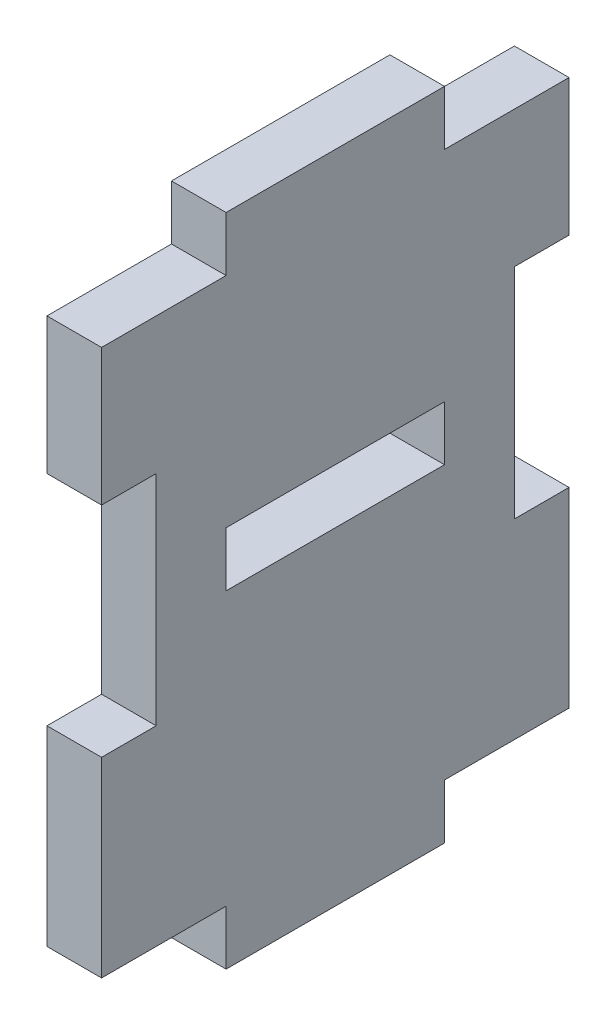
ISO-10303-21;
HEADER;
FILE_DESCRIPTION(('STEP AP214'),'2;1');
FILE_NAME('part.step','',(''),(''),'','','');
FILE_SCHEMA(('AUTOMOTIVE_DESIGN { 1 0 10303 214 1 1 1 1 }'));
ENDSEC;
DATA;
#1=APPLICATION_CONTEXT('core data for automotive mechanical design processes');
#2=APPLICATION_PROTOCOL_DEFINITION('international standard','automotive_design',2000,#1);
#3=PRODUCT_CONTEXT('',#1,'mechanical');
#4=PRODUCT('Part','Part','',(#3));
#5=PRODUCT_RELATED_PRODUCT_CATEGORY('part','',(#4));
#6=PRODUCT_DEFINITION_FORMATION('','',#4);
#7=PRODUCT_DEFINITION_CONTEXT('part definition',#1,'design');
#8=PRODUCT_DEFINITION('design','',#6,#7);
#9=PRODUCT_DEFINITION_SHAPE('','',#8);
#10=(LENGTH_UNIT() NAMED_UNIT(*) SI_UNIT(.MILLI.,.METRE.));
#11=(NAMED_UNIT(*) PLANE_ANGLE_UNIT() SI_UNIT($,.RADIAN.));
#12=(NAMED_UNIT(*) SI_UNIT($,.STERADIAN.) SOLID_ANGLE_UNIT());
#13=UNCERTAINTY_MEASURE_WITH_UNIT(LENGTH_MEASURE(1.E-05),#10,'distance_accuracy_value','');
#14=(GEOMETRIC_REPRESENTATION_CONTEXT(3) GLOBAL_UNCERTAINTY_ASSIGNED_CONTEXT((#13)) GLOBAL_UNIT_ASSIGNED_CONTEXT((#10,
#11,#12)) REPRESENTATION_CONTEXT('',''));
#15=CARTESIAN_POINT('',(0.,0.,0.));
#16=DIRECTION('',(0.,0.,1.));
#17=DIRECTION('',(1.,0.,0.));
#18=AXIS2_PLACEMENT_3D('',#15,#16,#17);
#19=CARTESIAN_POINT('',(6.35,0.,-39.878));
#20=DIRECTION('',(1.,0.,0.));
#21=DIRECTION('',(0.,0.,-1.));
#22=AXIS2_PLACEMENT_3D('',#19,#20,#21);
#23=PLANE('',#22);
#24=DIRECTION('',(0.,0.,-1.));
#25=VECTOR('',#24,1.);
#26=CARTESIAN_POINT('',(6.35,0.,-14.478));
#27=LINE('',#26,#25);
#28=CARTESIAN_POINT('',(6.35,0.,-14.478));
#29=VERTEX_POINT('',#28);
#30=CARTESIAN_POINT('',(6.35,0.,-39.878));
#31=VERTEX_POINT('',#30);
#32=EDGE_CURVE('E228',#29,#31,#27,.T.);
#33=ORIENTED_EDGE('',*,*,#32,.T.);
#34=DIRECTION('',(0.,1.,0.));
#35=VECTOR('',#34,1.);
#36=CARTESIAN_POINT('',(6.35,0.,-39.878));
#37=LINE('',#36,#35);
#38=CARTESIAN_POINT('',(6.35,6.35,-39.878));
#39=VERTEX_POINT('',#38);
#40=EDGE_CURVE('E231',#31,#39,#37,.T.);
#41=ORIENTED_EDGE('',*,*,#40,.T.);
#42=DIRECTION('',(0.,0.,-1.));
#43=VECTOR('',#42,1.);
#44=CARTESIAN_POINT('',(6.35,6.35,-39.878));
#45=LINE('',#44,#43);
#46=CARTESIAN_POINT('',(6.35,6.35,-54.356));
#47=VERTEX_POINT('',#46);
#48=EDGE_CURVE('E234',#39,#47,#45,.T.);
#49=ORIENTED_EDGE('',*,*,#48,.T.);
#50=DIRECTION('',(0.,1.,0.));
#51=VECTOR('',#50,1.);
#52=CARTESIAN_POINT('',(6.35,6.35,-54.356));
#53=LINE('',#52,#51);
#54=CARTESIAN_POINT('',(6.35,28.575,-54.356));
#55=VERTEX_POINT('',#54);
#56=EDGE_CURVE('E236',#47,#55,#53,.T.);
#57=ORIENTED_EDGE('',*,*,#56,.T.);
#58=DIRECTION('',(0.,0.,1.));
#59=VECTOR('',#58,1.);
#60=CARTESIAN_POINT('',(6.35,28.575,-48.006));
#61=LINE('',#60,#59);
#62=CARTESIAN_POINT('',(6.35,28.575,-48.006));
#63=VERTEX_POINT('',#62);
#64=EDGE_CURVE('E238',#55,#63,#61,.T.);
#65=ORIENTED_EDGE('',*,*,#64,.T.);
#66=DIRECTION('',(0.,1.,0.));
#67=VECTOR('',#66,1.);
#68=CARTESIAN_POINT('',(6.35,53.975,-48.006));
#69=LINE('',#68,#67);
#70=CARTESIAN_POINT('',(6.35,53.975,-48.006));
#71=VERTEX_POINT('',#70);
#72=EDGE_CURVE('E240',#63,#71,#69,.T.);
#73=ORIENTED_EDGE('',*,*,#72,.T.);
#74=DIRECTION('',(0.,0.,-1.));
#75=VECTOR('',#74,1.);
#76=CARTESIAN_POINT('',(6.35,53.975,-54.356));
#77=LINE('',#76,#75);
#78=CARTESIAN_POINT('',(6.35,53.975,-54.356));
#79=VERTEX_POINT('',#78);
#80=EDGE_CURVE('E242',#71,#79,#77,.T.);
#81=ORIENTED_EDGE('',*,*,#80,.T.);
#82=DIRECTION('',(0.,1.,0.));
#83=VECTOR('',#82,1.);
#84=CARTESIAN_POINT('',(6.35,53.975,-54.356));
#85=LINE('',#84,#83);
#86=CARTESIAN_POINT('',(6.35,69.85,-54.356));
#87=VERTEX_POINT('',#86);
#88=EDGE_CURVE('E244',#79,#87,#85,.T.);
#89=ORIENTED_EDGE('',*,*,#88,.T.);
#90=DIRECTION('',(0.,0.,1.));
#91=VECTOR('',#90,1.);
#92=CARTESIAN_POINT('',(6.35,69.85,-54.356));
#93=LINE('',#92,#91);
#94=CARTESIAN_POINT('',(6.35,69.85,-39.878));
#95=VERTEX_POINT('',#94);
#96=EDGE_CURVE('E246',#87,#95,#93,.T.);
#97=ORIENTED_EDGE('',*,*,#96,.T.);
#98=DIRECTION('',(0.,1.,0.));
#99=VECTOR('',#98,1.);
#100=CARTESIAN_POINT('',(6.35,76.2,-39.878));
#101=LINE('',#100,#99);
#102=CARTESIAN_POINT('',(6.35,76.2,-39.878));
#103=VERTEX_POINT('',#102);
#104=EDGE_CURVE('E248',#95,#103,#101,.T.);
#105=ORIENTED_EDGE('',*,*,#104,.T.);
#106=DIRECTION('',(0.,0.,1.));
#107=VECTOR('',#106,1.);
#108=CARTESIAN_POINT('',(6.35,76.2,-14.478));
#109=LINE('',#108,#107);
#110=CARTESIAN_POINT('',(6.35,76.2,-14.478));
#111=VERTEX_POINT('',#110);
#112=EDGE_CURVE('E250',#103,#111,#109,.T.);
#113=ORIENTED_EDGE('',*,*,#112,.T.);
#114=DIRECTION('',(0.,-1.,0.));
#115=VECTOR('',#114,1.);
#116=CARTESIAN_POINT('',(6.35,69.85,-14.478));
#117=LINE('',#116,#115);
#118=CARTESIAN_POINT('',(6.35,69.85,-14.478));
#119=VERTEX_POINT('',#118);
#120=EDGE_CURVE('E252',#111,#119,#117,.T.);
#121=ORIENTED_EDGE('',*,*,#120,.T.);
#122=DIRECTION('',(0.,0.,1.));
#123=VECTOR('',#122,1.);
#124=CARTESIAN_POINT('',(6.35,69.85,-14.478));
#125=LINE('',#124,#123);
#126=CARTESIAN_POINT('',(6.35,69.85,0.));
#127=VERTEX_POINT('',#126);
#128=EDGE_CURVE('E254',#119,#127,#125,.T.);
#129=ORIENTED_EDGE('',*,*,#128,.T.);
#130=DIRECTION('',(0.,-1.,0.));
#131=VECTOR('',#130,1.);
#132=CARTESIAN_POINT('',(6.35,69.85,0.));
#133=LINE('',#132,#131);
#134=CARTESIAN_POINT('',(6.35,53.975,0.));
#135=VERTEX_POINT('',#134);
#136=EDGE_CURVE('E256',#127,#135,#133,.T.);
#137=ORIENTED_EDGE('',*,*,#136,.T.);
#138=DIRECTION('',(0.,0.,-1.));
#139=VECTOR('',#138,1.);
#140=CARTESIAN_POINT('',(6.35,53.975,0.));
#141=LINE('',#140,#139);
#142=CARTESIAN_POINT('',(6.35,53.975,-6.34999999999999));
#143=VERTEX_POINT('',#142);
#144=EDGE_CURVE('E258',#135,#143,#141,.T.);
#145=ORIENTED_EDGE('',*,*,#144,.T.);
#146=DIRECTION('',(0.,-1.,0.));
#147=VECTOR('',#146,1.);
#148=CARTESIAN_POINT('',(6.35,53.975,-6.34999999999999));
#149=LINE('',#148,#147);
#150=CARTESIAN_POINT('',(6.35,28.575,-6.35));
#151=VERTEX_POINT('',#150);
#152=EDGE_CURVE('E260',#143,#151,#149,.T.);
#153=ORIENTED_EDGE('',*,*,#152,.T.);
#154=DIRECTION('',(0.,0.,1.));
#155=VECTOR('',#154,1.);
#156=CARTESIAN_POINT('',(6.35,28.575,-6.35));
#157=LINE('',#156,#155);
#158=CARTESIAN_POINT('',(6.35,28.575,0.));
#159=VERTEX_POINT('',#158);
#160=EDGE_CURVE('E262',#151,#159,#157,.T.);
#161=ORIENTED_EDGE('',*,*,#160,.T.);
#162=DIRECTION('',(0.,-1.,0.));
#163=VECTOR('',#162,1.);
#164=CARTESIAN_POINT('',(6.35,28.575,0.));
#165=LINE('',#164,#163);
#166=CARTESIAN_POINT('',(6.35,6.35,0.));
#167=VERTEX_POINT('',#166);
#168=EDGE_CURVE('E264',#159,#167,#165,.T.);
#169=ORIENTED_EDGE('',*,*,#168,.T.);
#170=DIRECTION('',(0.,0.,-1.));
#171=VECTOR('',#170,1.);
#172=CARTESIAN_POINT('',(6.35,6.35,0.));
#173=LINE('',#172,#171);
#174=CARTESIAN_POINT('',(6.35,6.34999999999999,-14.478));
#175=VERTEX_POINT('',#174);
#176=EDGE_CURVE('E266',#167,#175,#173,.T.);
#177=ORIENTED_EDGE('',*,*,#176,.T.);
#178=DIRECTION('',(0.,-1.,0.));
#179=VECTOR('',#178,1.);
#180=CARTESIAN_POINT('',(6.35,0.,-14.478));
#181=LINE('',#180,#179);
#182=EDGE_CURVE('E268',#175,#29,#181,.T.);
#183=ORIENTED_EDGE('',*,*,#182,.T.);
#184=EDGE_LOOP('',(#33,#41,#49,#57,#65,#73,#81,#89,#97,#105,#113,#121,#129,#137,#145,#153,#161,
#169,#177,#183));
#185=FACE_BOUND('',#184,.T.);
#186=DIRECTION('',(0.,0.,-1.));
#187=VECTOR('',#186,1.);
#188=CARTESIAN_POINT('',(6.35,38.1,-14.478));
#189=LINE('',#188,#187);
#190=CARTESIAN_POINT('',(6.35,38.1,-14.478));
#191=VERTEX_POINT('',#190);
#192=CARTESIAN_POINT('',(6.35,38.1,-39.8780000000001));
#193=VERTEX_POINT('',#192);
#194=EDGE_CURVE('E200',#191,#193,#189,.T.);
#195=ORIENTED_EDGE('',*,*,#194,.F.);
#196=DIRECTION('',(0.,-1.,0.));
#197=VECTOR('',#196,1.);
#198=CARTESIAN_POINT('',(6.35,44.45,-14.478));
#199=LINE('',#198,#197);
#200=CARTESIAN_POINT('',(6.35,44.45,-14.478));
#201=VERTEX_POINT('',#200);
#202=EDGE_CURVE('E192',#201,#191,#199,.T.);
#203=ORIENTED_EDGE('',*,*,#202,.F.);
#204=DIRECTION('',(0.,0.,1.));
#205=VECTOR('',#204,1.);
#206=CARTESIAN_POINT('',(6.35,44.45,-14.478));
#207=LINE('',#206,#205);
#208=CARTESIAN_POINT('',(6.35,44.45,-39.8780000000001));
#209=VERTEX_POINT('',#208);
#210=EDGE_CURVE('E214',#209,#201,#207,.T.);
#211=ORIENTED_EDGE('',*,*,#210,.F.);
#212=DIRECTION('',(0.,1.,0.));
#213=VECTOR('',#212,1.);
#214=CARTESIAN_POINT('',(6.35,44.45,-39.8780000000001));
#215=LINE('',#214,#213);
#216=EDGE_CURVE('E212',#193,#209,#215,.T.);
#217=ORIENTED_EDGE('',*,*,#216,.F.);
#218=EDGE_LOOP('',(#195,#203,#211,#217));
#219=FACE_BOUND('',#218,.T.);
#220=ADVANCED_FACE('F31',(#185,#219),#23,.T.);
#221=CARTESIAN_POINT('',(0.,0.,-39.878));
#222=DIRECTION('',(1.,0.,0.));
#223=DIRECTION('',(0.,0.,-1.));
#224=AXIS2_PLACEMENT_3D('',#221,#222,#223);
#225=PLANE('',#224);
#226=DIRECTION('',(0.,0.,-1.));
#227=VECTOR('',#226,1.);
#228=CARTESIAN_POINT('',(0.,0.,-14.478));
#229=LINE('',#228,#227);
#230=CARTESIAN_POINT('',(0.,0.,-14.478));
#231=VERTEX_POINT('',#230);
#232=CARTESIAN_POINT('',(0.,0.,-39.878));
#233=VERTEX_POINT('',#232);
#234=EDGE_CURVE('E208',#231,#233,#229,.T.);
#235=ORIENTED_EDGE('',*,*,#234,.F.);
#236=DIRECTION('',(0.,-1.,0.));
#237=VECTOR('',#236,1.);
#238=CARTESIAN_POINT('',(0.,0.,-14.478));
#239=LINE('',#238,#237);
#240=CARTESIAN_POINT('',(0.,6.34999999999999,-14.478));
#241=VERTEX_POINT('',#240);
#242=EDGE_CURVE('E232',#241,#231,#239,.T.);
#243=ORIENTED_EDGE('',*,*,#242,.F.);
#244=DIRECTION('',(0.,0.,-1.));
#245=VECTOR('',#244,1.);
#246=CARTESIAN_POINT('',(0.,6.35,0.));
#247=LINE('',#246,#245);
#248=CARTESIAN_POINT('',(0.,6.35,0.));
#249=VERTEX_POINT('',#248);
#250=EDGE_CURVE('E307',#249,#241,#247,.T.);
#251=ORIENTED_EDGE('',*,*,#250,.F.);
#252=DIRECTION('',(0.,-1.,0.));
#253=VECTOR('',#252,1.);
#254=CARTESIAN_POINT('',(0.,28.575,0.));
#255=LINE('',#254,#253);
#256=CARTESIAN_POINT('',(0.,28.575,0.));
#257=VERTEX_POINT('',#256);
#258=EDGE_CURVE('E305',#257,#249,#255,.T.);
#259=ORIENTED_EDGE('',*,*,#258,.F.);
#260=DIRECTION('',(0.,0.,1.));
#261=VECTOR('',#260,1.);
#262=CARTESIAN_POINT('',(0.,28.575,-6.35));
#263=LINE('',#262,#261);
#264=CARTESIAN_POINT('',(0.,28.575,-6.35));
#265=VERTEX_POINT('',#264);
#266=EDGE_CURVE('E303',#265,#257,#263,.T.);
#267=ORIENTED_EDGE('',*,*,#266,.F.);
#268=DIRECTION('',(0.,-1.,0.));
#269=VECTOR('',#268,1.);
#270=CARTESIAN_POINT('',(0.,53.975,-6.34999999999999));
#271=LINE('',#270,#269);
#272=CARTESIAN_POINT('',(0.,53.975,-6.34999999999999));
#273=VERTEX_POINT('',#272);
#274=EDGE_CURVE('E301',#273,#265,#271,.T.);
#275=ORIENTED_EDGE('',*,*,#274,.F.);
#276=DIRECTION('',(0.,0.,-1.));
#277=VECTOR('',#276,1.);
#278=CARTESIAN_POINT('',(0.,53.975,0.));
#279=LINE('',#278,#277);
#280=CARTESIAN_POINT('',(0.,53.975,0.));
#281=VERTEX_POINT('',#280);
#282=EDGE_CURVE('E299',#281,#273,#279,.T.);
#283=ORIENTED_EDGE('',*,*,#282,.F.);
#284=DIRECTION('',(0.,-1.,0.));
#285=VECTOR('',#284,1.);
#286=CARTESIAN_POINT('',(0.,69.85,0.));
#287=LINE('',#286,#285);
#288=CARTESIAN_POINT('',(0.,69.85,0.));
#289=VERTEX_POINT('',#288);
#290=EDGE_CURVE('E297',#289,#281,#287,.T.);
#291=ORIENTED_EDGE('',*,*,#290,.F.);
#292=DIRECTION('',(0.,0.,1.));
#293=VECTOR('',#292,1.);
#294=CARTESIAN_POINT('',(0.,69.85,-14.478));
#295=LINE('',#294,#293);
#296=CARTESIAN_POINT('',(0.,69.85,-14.478));
#297=VERTEX_POINT('',#296);
#298=EDGE_CURVE('E295',#297,#289,#295,.T.);
#299=ORIENTED_EDGE('',*,*,#298,.F.);
#300=DIRECTION('',(0.,-1.,0.));
#301=VECTOR('',#300,1.);
#302=CARTESIAN_POINT('',(0.,69.85,-14.478));
#303=LINE('',#302,#301);
#304=CARTESIAN_POINT('',(0.,76.2,-14.478));
#305=VERTEX_POINT('',#304);
#306=EDGE_CURVE('E293',#305,#297,#303,.T.);
#307=ORIENTED_EDGE('',*,*,#306,.F.);
#308=DIRECTION('',(0.,0.,1.));
#309=VECTOR('',#308,1.);
#310=CARTESIAN_POINT('',(0.,76.2,-14.478));
#311=LINE('',#310,#309);
#312=CARTESIAN_POINT('',(0.,76.2,-39.878));
#313=VERTEX_POINT('',#312);
#314=EDGE_CURVE('E291',#313,#305,#311,.T.);
#315=ORIENTED_EDGE('',*,*,#314,.F.);
#316=DIRECTION('',(0.,1.,0.));
#317=VECTOR('',#316,1.);
#318=CARTESIAN_POINT('',(0.,76.2,-39.878));
#319=LINE('',#318,#317);
#320=CARTESIAN_POINT('',(0.,69.85,-39.878));
#321=VERTEX_POINT('',#320);
#322=EDGE_CURVE('E289',#321,#313,#319,.T.);
#323=ORIENTED_EDGE('',*,*,#322,.F.);
#324=DIRECTION('',(0.,0.,1.));
#325=VECTOR('',#324,1.);
#326=CARTESIAN_POINT('',(0.,69.85,-54.356));
#327=LINE('',#326,#325);
#328=CARTESIAN_POINT('',(0.,69.85,-54.356));
#329=VERTEX_POINT('',#328);
#330=EDGE_CURVE('E287',#329,#321,#327,.T.);
#331=ORIENTED_EDGE('',*,*,#330,.F.);
#332=DIRECTION('',(0.,1.,0.));
#333=VECTOR('',#332,1.);
#334=CARTESIAN_POINT('',(0.,53.975,-54.356));
#335=LINE('',#334,#333);
#336=CARTESIAN_POINT('',(0.,53.975,-54.356));
#337=VERTEX_POINT('',#336);
#338=EDGE_CURVE('E285',#337,#329,#335,.T.);
#339=ORIENTED_EDGE('',*,*,#338,.F.);
#340=DIRECTION('',(0.,0.,-1.));
#341=VECTOR('',#340,1.);
#342=CARTESIAN_POINT('',(0.,53.975,-54.356));
#343=LINE('',#342,#341);
#344=CARTESIAN_POINT('',(0.,53.975,-48.006));
#345=VERTEX_POINT('',#344);
#346=EDGE_CURVE('E283',#345,#337,#343,.T.);
#347=ORIENTED_EDGE('',*,*,#346,.F.);
#348=DIRECTION('',(0.,1.,0.));
#349=VECTOR('',#348,1.);
#350=CARTESIAN_POINT('',(0.,53.975,-48.006));
#351=LINE('',#350,#349);
#352=CARTESIAN_POINT('',(0.,28.575,-48.006));
#353=VERTEX_POINT('',#352);
#354=EDGE_CURVE('E281',#353,#345,#351,.T.);
#355=ORIENTED_EDGE('',*,*,#354,.F.);
#356=DIRECTION('',(0.,0.,1.));
#357=VECTOR('',#356,1.);
#358=CARTESIAN_POINT('',(0.,28.575,-48.006));
#359=LINE('',#358,#357);
#360=CARTESIAN_POINT('',(0.,28.575,-54.356));
#361=VERTEX_POINT('',#360);
#362=EDGE_CURVE('E279',#361,#353,#359,.T.);
#363=ORIENTED_EDGE('',*,*,#362,.F.);
#364=DIRECTION('',(0.,1.,0.));
#365=VECTOR('',#364,1.);
#366=CARTESIAN_POINT('',(0.,6.35,-54.356));
#367=LINE('',#366,#365);
#368=CARTESIAN_POINT('',(0.,6.35,-54.356));
#369=VERTEX_POINT('',#368);
#370=EDGE_CURVE('E277',#369,#361,#367,.T.);
#371=ORIENTED_EDGE('',*,*,#370,.F.);
#372=DIRECTION('',(0.,0.,-1.));
#373=VECTOR('',#372,1.);
#374=CARTESIAN_POINT('',(0.,6.35,-39.878));
#375=LINE('',#374,#373);
#376=CARTESIAN_POINT('',(0.,6.35,-39.878));
#377=VERTEX_POINT('',#376);
#378=EDGE_CURVE('E275',#377,#369,#375,.T.);
#379=ORIENTED_EDGE('',*,*,#378,.F.);
#380=DIRECTION('',(0.,1.,0.));
#381=VECTOR('',#380,1.);
#382=CARTESIAN_POINT('',(0.,0.,-39.878));
#383=LINE('',#382,#381);
#384=EDGE_CURVE('E273',#233,#377,#383,.T.);
#385=ORIENTED_EDGE('',*,*,#384,.F.);
#386=EDGE_LOOP('',(#235,#243,#251,#259,#267,#275,#283,#291,#299,#307,#315,#323,#331,#339,#347,
#355,#363,#371,#379,#385));
#387=FACE_BOUND('',#386,.T.);
#388=DIRECTION('',(0.,-1.,0.));
#389=VECTOR('',#388,1.);
#390=CARTESIAN_POINT('',(0.,44.45,-14.478));
#391=LINE('',#390,#389);
#392=CARTESIAN_POINT('',(0.,44.45,-14.478));
#393=VERTEX_POINT('',#392);
#394=CARTESIAN_POINT('',(0.,38.1,-14.478));
#395=VERTEX_POINT('',#394);
#396=EDGE_CURVE('E54',#393,#395,#391,.T.);
#397=ORIENTED_EDGE('',*,*,#396,.T.);
#398=DIRECTION('',(0.,0.,-1.));
#399=VECTOR('',#398,1.);
#400=CARTESIAN_POINT('',(0.,38.1,-14.478));
#401=LINE('',#400,#399);
#402=CARTESIAN_POINT('',(0.,38.1,-39.8780000000001));
#403=VERTEX_POINT('',#402);
#404=EDGE_CURVE('E207',#395,#403,#401,.T.);
#405=ORIENTED_EDGE('',*,*,#404,.T.);
#406=DIRECTION('',(0.,1.,0.));
#407=VECTOR('',#406,1.);
#408=CARTESIAN_POINT('',(0.,44.45,-39.8780000000001));
#409=LINE('',#408,#407);
#410=CARTESIAN_POINT('',(0.,44.45,-39.8780000000001));
#411=VERTEX_POINT('',#410);
#412=EDGE_CURVE('E220',#403,#411,#409,.T.);
#413=ORIENTED_EDGE('',*,*,#412,.T.);
#414=DIRECTION('',(0.,0.,1.));
#415=VECTOR('',#414,1.);
#416=CARTESIAN_POINT('',(0.,44.45,-14.478));
#417=LINE('',#416,#415);
#418=EDGE_CURVE('E201',#411,#393,#417,.T.);
#419=ORIENTED_EDGE('',*,*,#418,.T.);
#420=EDGE_LOOP('',(#397,#405,#413,#419));
#421=FACE_BOUND('',#420,.T.);
#422=ADVANCED_FACE('F373',(#387,#421),#225,.F.);
#423=CARTESIAN_POINT('',(6.35,0.,-14.478));
#424=DIRECTION('',(0.,1.,0.));
#425=DIRECTION('',(0.,0.,1.));
#426=AXIS2_PLACEMENT_3D('',#423,#424,#425);
#427=PLANE('',#426);
#428=ORIENTED_EDGE('',*,*,#234,.T.);
#429=DIRECTION('',(-1.,0.,0.));
#430=VECTOR('',#429,1.);
#431=CARTESIAN_POINT('',(6.35,0.,-39.878));
#432=LINE('',#431,#430);
#433=EDGE_CURVE('E11',#31,#233,#432,.T.);
#434=ORIENTED_EDGE('',*,*,#433,.F.);
#435=ORIENTED_EDGE('',*,*,#32,.F.);
#436=DIRECTION('',(-1.,0.,0.));
#437=VECTOR('',#436,1.);
#438=CARTESIAN_POINT('',(6.35,0.,-14.478));
#439=LINE('',#438,#437);
#440=EDGE_CURVE('E270',#29,#231,#439,.T.);
#441=ORIENTED_EDGE('',*,*,#440,.T.);
#442=EDGE_LOOP('',(#428,#434,#435,#441));
#443=FACE_BOUND('',#442,.T.);
#444=ADVANCED_FACE('F33',(#443),#427,.F.);
#445=CARTESIAN_POINT('',(6.35,0.,-39.878));
#446=DIRECTION('',(0.,0.,1.));
#447=DIRECTION('',(1.,0.,0.));
#448=AXIS2_PLACEMENT_3D('',#445,#446,#447);
#449=PLANE('',#448);
#450=ORIENTED_EDGE('',*,*,#384,.T.);
#451=DIRECTION('',(-1.,0.,0.));
#452=VECTOR('',#451,1.);
#453=CARTESIAN_POINT('',(6.35,6.35,-39.878));
#454=LINE('',#453,#452);
#455=EDGE_CURVE('E39',#39,#377,#454,.T.);
#456=ORIENTED_EDGE('',*,*,#455,.F.);
#457=ORIENTED_EDGE('',*,*,#40,.F.);
#458=ORIENTED_EDGE('',*,*,#433,.T.);
#459=EDGE_LOOP('',(#450,#456,#457,#458));
#460=FACE_BOUND('',#459,.T.);
#461=ADVANCED_FACE('F390',(#460),#449,.F.);
#462=CARTESIAN_POINT('',(6.35,6.35,-39.878));
#463=DIRECTION('',(0.,1.,0.));
#464=DIRECTION('',(0.,0.,1.));
#465=AXIS2_PLACEMENT_3D('',#462,#463,#464);
#466=PLANE('',#465);
#467=ORIENTED_EDGE('',*,*,#378,.T.);
#468=DIRECTION('',(-1.,0.,0.));
#469=VECTOR('',#468,1.);
#470=CARTESIAN_POINT('',(6.35,6.35,-54.356));
#471=LINE('',#470,#469);
#472=EDGE_CURVE('E360',#47,#369,#471,.T.);
#473=ORIENTED_EDGE('',*,*,#472,.F.);
#474=ORIENTED_EDGE('',*,*,#48,.F.);
#475=ORIENTED_EDGE('',*,*,#455,.T.);
#476=EDGE_LOOP('',(#467,#473,#474,#475));
#477=FACE_BOUND('',#476,.T.);
#478=ADVANCED_FACE('F367',(#477),#466,.F.);
#479=CARTESIAN_POINT('',(6.35,6.35,-54.356));
#480=DIRECTION('',(0.,0.,1.));
#481=DIRECTION('',(0.,-1.,0.));
#482=AXIS2_PLACEMENT_3D('',#479,#480,#481);
#483=PLANE('',#482);
#484=ORIENTED_EDGE('',*,*,#370,.T.);
#485=DIRECTION('',(-1.,0.,0.));
#486=VECTOR('',#485,1.);
#487=CARTESIAN_POINT('',(6.35,28.575,-54.356));
#488=LINE('',#487,#486);
#489=EDGE_CURVE('E357',#55,#361,#488,.T.);
#490=ORIENTED_EDGE('',*,*,#489,.F.);
#491=ORIENTED_EDGE('',*,*,#56,.F.);
#492=ORIENTED_EDGE('',*,*,#472,.T.);
#493=EDGE_LOOP('',(#484,#490,#491,#492));
#494=FACE_BOUND('',#493,.T.);
#495=ADVANCED_FACE('F379',(#494),#483,.F.);
#496=CARTESIAN_POINT('',(6.35,28.575,-48.006));
#497=DIRECTION('',(0.,-1.,0.));
#498=DIRECTION('',(0.,0.,-1.));
#499=AXIS2_PLACEMENT_3D('',#496,#497,#498);
#500=PLANE('',#499);
#501=ORIENTED_EDGE('',*,*,#362,.T.);
#502=DIRECTION('',(-1.,0.,0.));
#503=VECTOR('',#502,1.);
#504=CARTESIAN_POINT('',(6.35,28.575,-48.006));
#505=LINE('',#504,#503);
#506=EDGE_CURVE('E354',#63,#353,#505,.T.);
#507=ORIENTED_EDGE('',*,*,#506,.F.);
#508=ORIENTED_EDGE('',*,*,#64,.F.);
#509=ORIENTED_EDGE('',*,*,#489,.T.);
#510=EDGE_LOOP('',(#501,#507,#508,#509));
#511=FACE_BOUND('',#510,.T.);
#512=ADVANCED_FACE('F383',(#511),#500,.F.);
#513=CARTESIAN_POINT('',(6.35,53.975,-48.006));
#514=DIRECTION('',(0.,0.,1.));
#515=DIRECTION('',(1.,0.,0.));
#516=AXIS2_PLACEMENT_3D('',#513,#514,#515);
#517=PLANE('',#516);
#518=ORIENTED_EDGE('',*,*,#354,.T.);
#519=DIRECTION('',(-1.,0.,0.));
#520=VECTOR('',#519,1.);
#521=CARTESIAN_POINT('',(6.35,53.975,-48.006));
#522=LINE('',#521,#520);
#523=EDGE_CURVE('E351',#71,#345,#522,.T.);
#524=ORIENTED_EDGE('',*,*,#523,.F.);
#525=ORIENTED_EDGE('',*,*,#72,.F.);
#526=ORIENTED_EDGE('',*,*,#506,.T.);
#527=EDGE_LOOP('',(#518,#524,#525,#526));
#528=FACE_BOUND('',#527,.T.);
#529=ADVANCED_FACE('F463',(#528),#517,.F.);
#530=CARTESIAN_POINT('',(6.35,53.975,-54.356));
#531=DIRECTION('',(0.,1.,0.));
#532=DIRECTION('',(0.,0.,1.));
#533=AXIS2_PLACEMENT_3D('',#530,#531,#532);
#534=PLANE('',#533);
#535=ORIENTED_EDGE('',*,*,#346,.T.);
#536=DIRECTION('',(-1.,0.,0.));
#537=VECTOR('',#536,1.);
#538=CARTESIAN_POINT('',(6.35,53.975,-54.356));
#539=LINE('',#538,#537);
#540=EDGE_CURVE('E348',#79,#337,#539,.T.);
#541=ORIENTED_EDGE('',*,*,#540,.F.);
#542=ORIENTED_EDGE('',*,*,#80,.F.);
#543=ORIENTED_EDGE('',*,*,#523,.T.);
#544=EDGE_LOOP('',(#535,#541,#542,#543));
#545=FACE_BOUND('',#544,.T.);
#546=ADVANCED_FACE('F461',(#545),#534,.F.);
#547=CARTESIAN_POINT('',(6.35,53.975,-54.356));
#548=DIRECTION('',(0.,0.,1.));
#549=DIRECTION('',(1.,0.,0.));
#550=AXIS2_PLACEMENT_3D('',#547,#548,#549);
#551=PLANE('',#550);
#552=ORIENTED_EDGE('',*,*,#338,.T.);
#553=DIRECTION('',(-1.,0.,0.));
#554=VECTOR('',#553,1.);
#555=CARTESIAN_POINT('',(6.35,69.85,-54.356));
#556=LINE('',#555,#554);
#557=EDGE_CURVE('E345',#87,#329,#556,.T.);
#558=ORIENTED_EDGE('',*,*,#557,.F.);
#559=ORIENTED_EDGE('',*,*,#88,.F.);
#560=ORIENTED_EDGE('',*,*,#540,.T.);
#561=EDGE_LOOP('',(#552,#558,#559,#560));
#562=FACE_BOUND('',#561,.T.);
#563=ADVANCED_FACE('F456',(#562),#551,.F.);
#564=CARTESIAN_POINT('',(6.35,69.85,-54.356));
#565=DIRECTION('',(0.,-1.,0.));
#566=DIRECTION('',(0.,0.,-1.));
#567=AXIS2_PLACEMENT_3D('',#564,#565,#566);
#568=PLANE('',#567);
#569=ORIENTED_EDGE('',*,*,#330,.T.);
#570=DIRECTION('',(-1.,0.,0.));
#571=VECTOR('',#570,1.);
#572=CARTESIAN_POINT('',(6.35,69.85,-39.878));
#573=LINE('',#572,#571);
#574=EDGE_CURVE('E342',#95,#321,#573,.T.);
#575=ORIENTED_EDGE('',*,*,#574,.F.);
#576=ORIENTED_EDGE('',*,*,#96,.F.);
#577=ORIENTED_EDGE('',*,*,#557,.T.);
#578=EDGE_LOOP('',(#569,#575,#576,#577));
#579=FACE_BOUND('',#578,.T.);
#580=ADVANCED_FACE('F451',(#579),#568,.F.);
#581=CARTESIAN_POINT('',(6.35,76.2,-39.878));
#582=DIRECTION('',(0.,0.,1.));
#583=DIRECTION('',(0.,-1.,0.));
#584=AXIS2_PLACEMENT_3D('',#581,#582,#583);
#585=PLANE('',#584);
#586=ORIENTED_EDGE('',*,*,#322,.T.);
#587=DIRECTION('',(-1.,0.,0.));
#588=VECTOR('',#587,1.);
#589=CARTESIAN_POINT('',(6.35,76.2,-39.878));
#590=LINE('',#589,#588);
#591=EDGE_CURVE('E339',#103,#313,#590,.T.);
#592=ORIENTED_EDGE('',*,*,#591,.F.);
#593=ORIENTED_EDGE('',*,*,#104,.F.);
#594=ORIENTED_EDGE('',*,*,#574,.T.);
#595=EDGE_LOOP('',(#586,#592,#593,#594));
#596=FACE_BOUND('',#595,.T.);
#597=ADVANCED_FACE('F447',(#596),#585,.F.);
#598=CARTESIAN_POINT('',(6.35,76.2,-14.478));
#599=DIRECTION('',(0.,-1.,0.));
#600=DIRECTION('',(0.,0.,-1.));
#601=AXIS2_PLACEMENT_3D('',#598,#599,#600);
#602=PLANE('',#601);
#603=ORIENTED_EDGE('',*,*,#314,.T.);
#604=DIRECTION('',(-1.,0.,0.));
#605=VECTOR('',#604,1.);
#606=CARTESIAN_POINT('',(6.35,76.2,-14.478));
#607=LINE('',#606,#605);
#608=EDGE_CURVE('E336',#111,#305,#607,.T.);
#609=ORIENTED_EDGE('',*,*,#608,.F.);
#610=ORIENTED_EDGE('',*,*,#112,.F.);
#611=ORIENTED_EDGE('',*,*,#591,.T.);
#612=EDGE_LOOP('',(#603,#609,#610,#611));
#613=FACE_BOUND('',#612,.T.);
#614=ADVANCED_FACE('F442',(#613),#602,.F.);
#615=CARTESIAN_POINT('',(6.35,69.85,-14.478));
#616=DIRECTION('',(0.,0.,-1.));
#617=DIRECTION('',(0.,1.,0.));
#618=AXIS2_PLACEMENT_3D('',#615,#616,#617);
#619=PLANE('',#618);
#620=ORIENTED_EDGE('',*,*,#306,.T.);
#621=DIRECTION('',(-1.,0.,0.));
#622=VECTOR('',#621,1.);
#623=CARTESIAN_POINT('',(6.35,69.85,-14.478));
#624=LINE('',#623,#622);
#625=EDGE_CURVE('E333',#119,#297,#624,.T.);
#626=ORIENTED_EDGE('',*,*,#625,.F.);
#627=ORIENTED_EDGE('',*,*,#120,.F.);
#628=ORIENTED_EDGE('',*,*,#608,.T.);
#629=EDGE_LOOP('',(#620,#626,#627,#628));
#630=FACE_BOUND('',#629,.T.);
#631=ADVANCED_FACE('F436',(#630),#619,.F.);
#632=CARTESIAN_POINT('',(6.35,69.85,-14.478));
#633=DIRECTION('',(0.,-1.,0.));
#634=DIRECTION('',(0.,0.,-1.));
#635=AXIS2_PLACEMENT_3D('',#632,#633,#634);
#636=PLANE('',#635);
#637=ORIENTED_EDGE('',*,*,#298,.T.);
#638=DIRECTION('',(-1.,0.,0.));
#639=VECTOR('',#638,1.);
#640=CARTESIAN_POINT('',(6.35,69.85,0.));
#641=LINE('',#640,#639);
#642=EDGE_CURVE('E330',#127,#289,#641,.T.);
#643=ORIENTED_EDGE('',*,*,#642,.F.);
#644=ORIENTED_EDGE('',*,*,#128,.F.);
#645=ORIENTED_EDGE('',*,*,#625,.T.);
#646=EDGE_LOOP('',(#637,#643,#644,#645));
#647=FACE_BOUND('',#646,.T.);
#648=ADVANCED_FACE('F432',(#647),#636,.F.);
#649=CARTESIAN_POINT('',(6.35,69.85,0.));
#650=DIRECTION('',(0.,0.,-1.));
#651=DIRECTION('',(0.,1.,0.));
#652=AXIS2_PLACEMENT_3D('',#649,#650,#651);
#653=PLANE('',#652);
#654=ORIENTED_EDGE('',*,*,#290,.T.);
#655=DIRECTION('',(-1.,0.,0.));
#656=VECTOR('',#655,1.);
#657=CARTESIAN_POINT('',(6.35,53.975,0.));
#658=LINE('',#657,#656);
#659=EDGE_CURVE('E327',#135,#281,#658,.T.);
#660=ORIENTED_EDGE('',*,*,#659,.F.);
#661=ORIENTED_EDGE('',*,*,#136,.F.);
#662=ORIENTED_EDGE('',*,*,#642,.T.);
#663=EDGE_LOOP('',(#654,#660,#661,#662));
#664=FACE_BOUND('',#663,.T.);
#665=ADVANCED_FACE('F427',(#664),#653,.F.);
#666=CARTESIAN_POINT('',(6.35,53.975,0.));
#667=DIRECTION('',(0.,1.,0.));
#668=DIRECTION('',(0.,0.,1.));
#669=AXIS2_PLACEMENT_3D('',#666,#667,#668);
#670=PLANE('',#669);
#671=ORIENTED_EDGE('',*,*,#282,.T.);
#672=DIRECTION('',(-1.,0.,0.));
#673=VECTOR('',#672,1.);
#674=CARTESIAN_POINT('',(6.35,53.975,-6.34999999999999));
#675=LINE('',#674,#673);
#676=EDGE_CURVE('E324',#143,#273,#675,.T.);
#677=ORIENTED_EDGE('',*,*,#676,.F.);
#678=ORIENTED_EDGE('',*,*,#144,.F.);
#679=ORIENTED_EDGE('',*,*,#659,.T.);
#680=EDGE_LOOP('',(#671,#677,#678,#679));
#681=FACE_BOUND('',#680,.T.);
#682=ADVANCED_FACE('F421',(#681),#670,.F.);
#683=CARTESIAN_POINT('',(6.35,53.975,-6.34999999999999));
#684=DIRECTION('',(0.,0.,-1.));
#685=DIRECTION('',(0.,1.,0.));
#686=AXIS2_PLACEMENT_3D('',#683,#684,#685);
#687=PLANE('',#686);
#688=ORIENTED_EDGE('',*,*,#274,.T.);
#689=DIRECTION('',(-1.,0.,0.));
#690=VECTOR('',#689,1.);
#691=CARTESIAN_POINT('',(6.35,28.575,-6.35));
#692=LINE('',#691,#690);
#693=EDGE_CURVE('E321',#151,#265,#692,.T.);
#694=ORIENTED_EDGE('',*,*,#693,.F.);
#695=ORIENTED_EDGE('',*,*,#152,.F.);
#696=ORIENTED_EDGE('',*,*,#676,.T.);
#697=EDGE_LOOP('',(#688,#694,#695,#696));
#698=FACE_BOUND('',#697,.T.);
#699=ADVANCED_FACE('F417',(#698),#687,.F.);
#700=CARTESIAN_POINT('',(6.35,28.575,-6.35));
#701=DIRECTION('',(0.,-1.,0.));
#702=DIRECTION('',(0.,0.,-1.));
#703=AXIS2_PLACEMENT_3D('',#700,#701,#702);
#704=PLANE('',#703);
#705=ORIENTED_EDGE('',*,*,#266,.T.);
#706=DIRECTION('',(-1.,0.,0.));
#707=VECTOR('',#706,1.);
#708=CARTESIAN_POINT('',(6.35,28.575,0.));
#709=LINE('',#708,#707);
#710=EDGE_CURVE('E318',#159,#257,#709,.T.);
#711=ORIENTED_EDGE('',*,*,#710,.F.);
#712=ORIENTED_EDGE('',*,*,#160,.F.);
#713=ORIENTED_EDGE('',*,*,#693,.T.);
#714=EDGE_LOOP('',(#705,#711,#712,#713));
#715=FACE_BOUND('',#714,.T.);
#716=ADVANCED_FACE('F412',(#715),#704,.F.);
#717=CARTESIAN_POINT('',(6.35,28.575,0.));
#718=DIRECTION('',(0.,0.,-1.));
#719=DIRECTION('',(0.,1.,0.));
#720=AXIS2_PLACEMENT_3D('',#717,#718,#719);
#721=PLANE('',#720);
#722=ORIENTED_EDGE('',*,*,#258,.T.);
#723=DIRECTION('',(-1.,0.,0.));
#724=VECTOR('',#723,1.);
#725=CARTESIAN_POINT('',(6.35,6.35,0.));
#726=LINE('',#725,#724);
#727=EDGE_CURVE('E315',#167,#249,#726,.T.);
#728=ORIENTED_EDGE('',*,*,#727,.F.);
#729=ORIENTED_EDGE('',*,*,#168,.F.);
#730=ORIENTED_EDGE('',*,*,#710,.T.);
#731=EDGE_LOOP('',(#722,#728,#729,#730));
#732=FACE_BOUND('',#731,.T.);
#733=ADVANCED_FACE('F406',(#732),#721,.F.);
#734=CARTESIAN_POINT('',(6.35,6.35,0.));
#735=DIRECTION('',(0.,1.,0.));
#736=DIRECTION('',(0.,0.,1.));
#737=AXIS2_PLACEMENT_3D('',#734,#735,#736);
#738=PLANE('',#737);
#739=ORIENTED_EDGE('',*,*,#250,.T.);
#740=DIRECTION('',(-1.,0.,0.));
#741=VECTOR('',#740,1.);
#742=CARTESIAN_POINT('',(6.35,6.34999999999999,-14.478));
#743=LINE('',#742,#741);
#744=EDGE_CURVE('E312',#175,#241,#743,.T.);
#745=ORIENTED_EDGE('',*,*,#744,.F.);
#746=ORIENTED_EDGE('',*,*,#176,.F.);
#747=ORIENTED_EDGE('',*,*,#727,.T.);
#748=EDGE_LOOP('',(#739,#745,#746,#747));
#749=FACE_BOUND('',#748,.T.);
#750=ADVANCED_FACE('F402',(#749),#738,.F.);
#751=CARTESIAN_POINT('',(6.35,0.,-14.478));
#752=DIRECTION('',(0.,0.,-1.));
#753=DIRECTION('',(-1.,0.,0.));
#754=AXIS2_PLACEMENT_3D('',#751,#752,#753);
#755=PLANE('',#754);
#756=ORIENTED_EDGE('',*,*,#242,.T.);
#757=ORIENTED_EDGE('',*,*,#440,.F.);
#758=ORIENTED_EDGE('',*,*,#182,.F.);
#759=ORIENTED_EDGE('',*,*,#744,.T.);
#760=EDGE_LOOP('',(#756,#757,#758,#759));
#761=FACE_BOUND('',#760,.T.);
#762=ADVANCED_FACE('F397',(#761),#755,.F.);
#763=CARTESIAN_POINT('',(6.35,44.45,-14.478));
#764=DIRECTION('',(0.,0.,-1.));
#765=DIRECTION('',(0.,1.,0.));
#766=AXIS2_PLACEMENT_3D('',#763,#764,#765);
#767=PLANE('',#766);
#768=ORIENTED_EDGE('',*,*,#396,.F.);
#769=DIRECTION('',(-1.,0.,0.));
#770=VECTOR('',#769,1.);
#771=CARTESIAN_POINT('',(6.35,44.45,-14.478));
#772=LINE('',#771,#770);
#773=EDGE_CURVE('E196',#201,#393,#772,.T.);
#774=ORIENTED_EDGE('',*,*,#773,.F.);
#775=ORIENTED_EDGE('',*,*,#202,.T.);
#776=DIRECTION('',(-1.,0.,0.));
#777=VECTOR('',#776,1.);
#778=CARTESIAN_POINT('',(6.35,38.1,-14.478));
#779=LINE('',#778,#777);
#780=EDGE_CURVE('E195',#191,#395,#779,.T.);
#781=ORIENTED_EDGE('',*,*,#780,.T.);
#782=EDGE_LOOP('',(#768,#774,#775,#781));
#783=FACE_BOUND('',#782,.T.);
#784=ADVANCED_FACE('F194',(#783),#767,.T.);
#785=CARTESIAN_POINT('',(6.35,38.1,-14.478));
#786=DIRECTION('',(0.,1.,0.));
#787=DIRECTION('',(0.,0.,1.));
#788=AXIS2_PLACEMENT_3D('',#785,#786,#787);
#789=PLANE('',#788);
#790=ORIENTED_EDGE('',*,*,#404,.F.);
#791=ORIENTED_EDGE('',*,*,#780,.F.);
#792=ORIENTED_EDGE('',*,*,#194,.T.);
#793=DIRECTION('',(-1.,0.,0.));
#794=VECTOR('',#793,1.);
#795=CARTESIAN_POINT('',(6.35,38.1,-39.8780000000001));
#796=LINE('',#795,#794);
#797=EDGE_CURVE('E209',#193,#403,#796,.T.);
#798=ORIENTED_EDGE('',*,*,#797,.T.);
#799=EDGE_LOOP('',(#790,#791,#792,#798));
#800=FACE_BOUND('',#799,.T.);
#801=ADVANCED_FACE('F204',(#800),#789,.T.);
#802=CARTESIAN_POINT('',(6.35,44.45,-39.8780000000001));
#803=DIRECTION('',(0.,0.,1.));
#804=DIRECTION('',(1.,0.,0.));
#805=AXIS2_PLACEMENT_3D('',#802,#803,#804);
#806=PLANE('',#805);
#807=ORIENTED_EDGE('',*,*,#412,.F.);
#808=ORIENTED_EDGE('',*,*,#797,.F.);
#809=ORIENTED_EDGE('',*,*,#216,.T.);
#810=DIRECTION('',(-1.,0.,0.));
#811=VECTOR('',#810,1.);
#812=CARTESIAN_POINT('',(6.35,44.45,-39.8780000000001));
#813=LINE('',#812,#811);
#814=EDGE_CURVE('E46',#209,#411,#813,.T.);
#815=ORIENTED_EDGE('',*,*,#814,.T.);
#816=EDGE_LOOP('',(#807,#808,#809,#815));
#817=FACE_BOUND('',#816,.T.);
#818=ADVANCED_FACE('F569',(#817),#806,.T.);
#819=CARTESIAN_POINT('',(6.35,44.45,-14.478));
#820=DIRECTION('',(0.,-1.,0.));
#821=DIRECTION('',(0.,0.,-1.));
#822=AXIS2_PLACEMENT_3D('',#819,#820,#821);
#823=PLANE('',#822);
#824=ORIENTED_EDGE('',*,*,#418,.F.);
#825=ORIENTED_EDGE('',*,*,#814,.F.);
#826=ORIENTED_EDGE('',*,*,#210,.T.);
#827=ORIENTED_EDGE('',*,*,#773,.T.);
#828=EDGE_LOOP('',(#824,#825,#826,#827));
#829=FACE_BOUND('',#828,.T.);
#830=ADVANCED_FACE('F575',(#829),#823,.T.);
#831=CLOSED_SHELL('',(#220,#422,#444,#461,#478,#495,#512,#529,#546,#563,#580,#597,#614,#631,
#648,#665,#682,#699,#716,#733,#750,#762,#784,#801,#818,#830));
#832=MANIFOLD_SOLID_BREP('B2',#831);
#833=ADVANCED_BREP_SHAPE_REPRESENTATION('',(#18,#832),#14);
#834=SHAPE_DEFINITION_REPRESENTATION(#9,#833);
ENDSEC;
END-ISO-10303-21;
